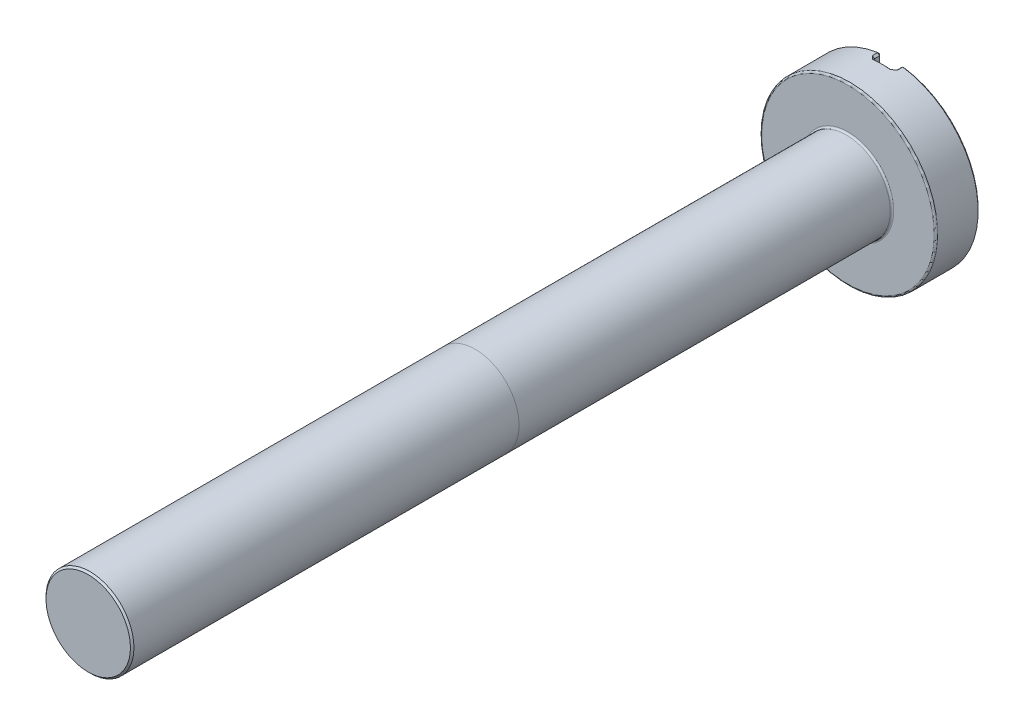
ISO-10303-21;
HEADER;
FILE_DESCRIPTION(('STEP AP214'),'2;1');
FILE_NAME('part.step','',(''),(''),'','','');
FILE_SCHEMA(('AUTOMOTIVE_DESIGN { 1 0 10303 214 1 1 1 1 }'));
ENDSEC;
DATA;
#1=APPLICATION_CONTEXT('core data for automotive mechanical design processes');
#2=APPLICATION_PROTOCOL_DEFINITION('international standard','automotive_design',2000,#1);
#3=PRODUCT_CONTEXT('',#1,'mechanical');
#4=PRODUCT('Part','Part','',(#3));
#5=PRODUCT_RELATED_PRODUCT_CATEGORY('part','',(#4));
#6=PRODUCT_DEFINITION_FORMATION('','',#4);
#7=PRODUCT_DEFINITION_CONTEXT('part definition',#1,'design');
#8=PRODUCT_DEFINITION('design','',#6,#7);
#9=PRODUCT_DEFINITION_SHAPE('','',#8);
#10=(LENGTH_UNIT() NAMED_UNIT(*) SI_UNIT(.MILLI.,.METRE.));
#11=(NAMED_UNIT(*) PLANE_ANGLE_UNIT() SI_UNIT($,.RADIAN.));
#12=(NAMED_UNIT(*) SI_UNIT($,.STERADIAN.) SOLID_ANGLE_UNIT());
#13=UNCERTAINTY_MEASURE_WITH_UNIT(LENGTH_MEASURE(1.E-05),#10,'distance_accuracy_value','');
#14=(GEOMETRIC_REPRESENTATION_CONTEXT(3) GLOBAL_UNCERTAINTY_ASSIGNED_CONTEXT((#13)) GLOBAL_UNIT_ASSIGNED_CONTEXT((#10,
#11,#12)) REPRESENTATION_CONTEXT('',''));
#15=CARTESIAN_POINT('',(0.,0.,0.));
#16=DIRECTION('',(0.,0.,1.));
#17=DIRECTION('',(1.,0.,0.));
#18=AXIS2_PLACEMENT_3D('',#15,#16,#17);
#19=CARTESIAN_POINT('',(0.,0.,216.));
#20=DIRECTION('',(0.,0.,-1.));
#21=DIRECTION('',(-1.,0.,0.));
#22=AXIS2_PLACEMENT_3D('',#19,#20,#21);
#23=CYLINDRICAL_SURFACE('',#22,12.5);
#24=CARTESIAN_POINT('',(0.,0.,215.5));
#25=DIRECTION('',(0.,0.,1.));
#26=DIRECTION('',(1.,0.,0.));
#27=AXIS2_PLACEMENT_3D('',#24,#25,#26);
#28=CIRCLE('',#27,12.5);
#29=CARTESIAN_POINT('',(12.5,0.,215.5));
#30=VERTEX_POINT('',#29);
#31=EDGE_CURVE('E59',#30,#30,#28,.F.);
#32=ORIENTED_EDGE('',*,*,#31,.T.);
#33=EDGE_LOOP('',(#32));
#34=FACE_BOUND('',#33,.T.);
#35=CARTESIAN_POINT('',(0.,0.,106.));
#36=DIRECTION('',(0.,0.,-1.));
#37=DIRECTION('',(-1.,0.,0.));
#38=AXIS2_PLACEMENT_3D('',#35,#36,#37);
#39=CIRCLE('',#38,12.5);
#40=CARTESIAN_POINT('',(-12.5,0.,106.));
#41=VERTEX_POINT('',#40);
#42=EDGE_CURVE('E11',#41,#41,#39,.T.);
#43=ORIENTED_EDGE('',*,*,#42,.F.);
#44=EDGE_LOOP('',(#43));
#45=FACE_BOUND('',#44,.T.);
#46=ADVANCED_FACE('F49',(#34,#45),#23,.T.);
#47=CARTESIAN_POINT('',(0.,0.,-12.5));
#48=DIRECTION('',(0.,0.,1.));
#49=DIRECTION('',(1.,0.,0.));
#50=AXIS2_PLACEMENT_3D('',#47,#48,#49);
#51=CYLINDRICAL_SURFACE('',#50,25.);
#52=CARTESIAN_POINT('',(0.,0.,-0.5));
#53=DIRECTION('',(0.,0.,-1.));
#54=DIRECTION('',(-1.,0.,0.));
#55=AXIS2_PLACEMENT_3D('',#52,#53,#54);
#56=CIRCLE('',#55,25.);
#57=CARTESIAN_POINT('',(-25.,0.,-0.5));
#58=VERTEX_POINT('',#57);
#59=EDGE_CURVE('E215',#58,#58,#56,.T.);
#60=ORIENTED_EDGE('',*,*,#59,.T.);
#61=EDGE_LOOP('',(#60));
#62=FACE_BOUND('',#61,.T.);
#63=CARTESIAN_POINT('',(3.57142857142857,-24.7435829652697,-10.5));
#64=CARTESIAN_POINT('',(3.48283128722029,-24.7563702333068,-10.411341223828));
#65=CARTESIAN_POINT('',(3.39398611806148,-24.7687086598073,-10.3228648452336));
#66=CARTESIAN_POINT('',(3.21576086205343,-24.7924782192305,-10.1463299338049));
#67=CARTESIAN_POINT('',(3.12638077482031,-24.8039093515019,-10.0582714012705));
#68=CARTESIAN_POINT('',(2.87577804068426,-24.8345759248479,-9.81282240398061));
#69=CARTESIAN_POINT('',(2.71391793275932,-24.8527929599123,-9.65595509518249));
#70=CARTESIAN_POINT('',(2.55102040816327,-24.8695053203142,-9.5));
#71=B_SPLINE_CURVE_WITH_KNOTS('',3,(#63,#64,#65,#66,#67,#68,#69,#70),.UNSPECIFIED.,.F.,.F.,(4,2,
2,4),(0.,0.377968117810572,0.75593650689692,1.43431941874157),.UNSPECIFIED.);
#72=CARTESIAN_POINT('',(3.57142857142857,-24.7435829652697,-10.5));
#73=VERTEX_POINT('',#72);
#74=CARTESIAN_POINT('',(2.55102040816327,-24.8695053203142,-9.5));
#75=VERTEX_POINT('',#74);
#76=EDGE_CURVE('E345',#73,#75,#71,.T.);
#77=ORIENTED_EDGE('',*,*,#76,.F.);
#78=DIRECTION('',(0.,0.,1.));
#79=VECTOR('',#78,1.);
#80=CARTESIAN_POINT('',(3.57142857142857,-24.7435829652697,-12.5));
#81=LINE('',#80,#79);
#82=CARTESIAN_POINT('',(3.57142857142857,-24.7435829652697,-12.));
#83=VERTEX_POINT('',#82);
#84=EDGE_CURVE('E355',#73,#83,#81,.F.);
#85=ORIENTED_EDGE('',*,*,#84,.T.);
#86=CARTESIAN_POINT('',(0.,0.,-12.));
#87=DIRECTION('',(0.,0.,-1.));
#88=DIRECTION('',(-1.,0.,0.));
#89=AXIS2_PLACEMENT_3D('',#86,#87,#88);
#90=CIRCLE('',#89,25.);
#91=CARTESIAN_POINT('',(3.57142857142857,24.7435829652697,-12.));
#92=VERTEX_POINT('',#91);
#93=EDGE_CURVE('E991',#83,#92,#90,.F.);
#94=ORIENTED_EDGE('',*,*,#93,.T.);
#95=DIRECTION('',(0.,0.,1.));
#96=VECTOR('',#95,1.);
#97=CARTESIAN_POINT('',(3.57142857142857,24.7435829652697,-12.5));
#98=LINE('',#97,#96);
#99=CARTESIAN_POINT('',(3.57142857142857,24.7435829652697,-10.5));
#100=VERTEX_POINT('',#99);
#101=EDGE_CURVE('E315',#92,#100,#98,.T.);
#102=ORIENTED_EDGE('',*,*,#101,.T.);
#103=CARTESIAN_POINT('',(2.55102040816327,24.8695053203142,-9.5));
#104=CARTESIAN_POINT('',(2.64178191386562,24.8601946587716,-9.58688711502499));
#105=CARTESIAN_POINT('',(2.73221965792439,24.850416341085,-9.67406070203431));
#106=CARTESIAN_POINT('',(2.91248879878854,24.8299345678886,-9.84892451642307));
#107=CARTESIAN_POINT('',(3.00232019629446,24.8192311134479,-9.93661474320537));
#108=CARTESIAN_POINT('',(3.25259245581336,24.7880383809925,-10.1823358745458));
#109=CARTESIAN_POINT('',(3.41240583045985,24.7665328543811,-10.340878285821));
#110=CARTESIAN_POINT('',(3.57142857142857,24.7435829652697,-10.5));
#111=B_SPLINE_CURVE_WITH_KNOTS('',3,(#103,#104,#105,#106,#107,#108,#109,#110),.UNSPECIFIED.,.F.,
.F.,(4,2,2,4),(0.,0.377969208692541,0.755937980612055,1.43432033029294),.UNSPECIFIED.);
#112=CARTESIAN_POINT('',(2.55102040816327,24.8695053203142,-9.5));
#113=VERTEX_POINT('',#112);
#114=EDGE_CURVE('E307',#113,#100,#111,.T.);
#115=ORIENTED_EDGE('',*,*,#114,.F.);
#116=CARTESIAN_POINT('',(0.,0.,-9.5));
#117=DIRECTION('',(0.,0.,1.));
#118=DIRECTION('',(1.,0.,0.));
#119=AXIS2_PLACEMENT_3D('',#116,#117,#118);
#120=CIRCLE('',#119,25.);
#121=CARTESIAN_POINT('',(-2.55102040816327,24.8695053203142,-9.5));
#122=VERTEX_POINT('',#121);
#123=EDGE_CURVE('E292',#113,#122,#120,.T.);
#124=ORIENTED_EDGE('',*,*,#123,.T.);
#125=CARTESIAN_POINT('',(-3.57142857142857,24.7435829652697,-10.5));
#126=CARTESIAN_POINT('',(-3.48283128722029,24.7563702333068,-10.411341223828));
#127=CARTESIAN_POINT('',(-3.39398611806148,24.7687086598073,-10.3228648452336));
#128=CARTESIAN_POINT('',(-3.21576086205343,24.7924782192305,-10.1463299338049));
#129=CARTESIAN_POINT('',(-3.12638077482031,24.8039093515019,-10.0582714012705));
#130=CARTESIAN_POINT('',(-2.87577804068426,24.8345759248479,-9.81282240398061));
#131=CARTESIAN_POINT('',(-2.71391793275932,24.8527929599123,-9.65595509518249));
#132=CARTESIAN_POINT('',(-2.55102040816327,24.8695053203142,-9.5));
#133=B_SPLINE_CURVE_WITH_KNOTS('',3,(#125,#126,#127,#128,#129,#130,#131,#132),.UNSPECIFIED.,.F.,
.F.,(4,2,2,4),(0.,0.377968117810572,0.75593650689692,1.43431941874157),.UNSPECIFIED.);
#134=CARTESIAN_POINT('',(-3.57142857142857,24.7435829652697,-10.5));
#135=VERTEX_POINT('',#134);
#136=EDGE_CURVE('E160',#135,#122,#133,.T.);
#137=ORIENTED_EDGE('',*,*,#136,.F.);
#138=DIRECTION('',(0.,0.,1.));
#139=VECTOR('',#138,1.);
#140=CARTESIAN_POINT('',(-3.57142857142857,24.7435829652697,-12.5));
#141=LINE('',#140,#139);
#142=CARTESIAN_POINT('',(-3.57142857142857,24.7435829652697,-12.));
#143=VERTEX_POINT('',#142);
#144=EDGE_CURVE('E154',#135,#143,#141,.F.);
#145=ORIENTED_EDGE('',*,*,#144,.T.);
#146=CARTESIAN_POINT('',(0.,0.,-12.));
#147=DIRECTION('',(0.,0.,-1.));
#148=DIRECTION('',(-1.,0.,0.));
#149=AXIS2_PLACEMENT_3D('',#146,#147,#148);
#150=CIRCLE('',#149,25.);
#151=CARTESIAN_POINT('',(-3.57142857142857,-24.7435829652697,-12.));
#152=VERTEX_POINT('',#151);
#153=EDGE_CURVE('E157',#143,#152,#150,.F.);
#154=ORIENTED_EDGE('',*,*,#153,.T.);
#155=DIRECTION('',(0.,0.,1.));
#156=VECTOR('',#155,1.);
#157=CARTESIAN_POINT('',(-3.57142857142857,-24.7435829652697,-12.5));
#158=LINE('',#157,#156);
#159=CARTESIAN_POINT('',(-3.57142857142857,-24.7435829652697,-10.5));
#160=VERTEX_POINT('',#159);
#161=EDGE_CURVE('E166',#152,#160,#158,.T.);
#162=ORIENTED_EDGE('',*,*,#161,.T.);
#163=CARTESIAN_POINT('',(-2.55102040816327,-24.8695053203142,-9.5));
#164=CARTESIAN_POINT('',(-2.64178191386562,-24.8601946587716,-9.58688711502499));
#165=CARTESIAN_POINT('',(-2.73221965792439,-24.850416341085,-9.67406070203431));
#166=CARTESIAN_POINT('',(-2.91248879878854,-24.8299345678886,-9.84892451642307));
#167=CARTESIAN_POINT('',(-3.00232019629446,-24.8192311134479,-9.93661474320537));
#168=CARTESIAN_POINT('',(-3.25259245581336,-24.7880383809925,-10.1823358745458));
#169=CARTESIAN_POINT('',(-3.41240583045985,-24.7665328543811,-10.340878285821));
#170=CARTESIAN_POINT('',(-3.57142857142857,-24.7435829652697,-10.5));
#171=B_SPLINE_CURVE_WITH_KNOTS('',3,(#163,#164,#165,#166,#167,#168,#169,#170),.UNSPECIFIED.,.F.,
.F.,(4,2,2,4),(0.,0.377969208692541,0.755937980612055,1.43432033029294),.UNSPECIFIED.);
#172=CARTESIAN_POINT('',(-2.55102040816327,-24.8695053203142,-9.5));
#173=VERTEX_POINT('',#172);
#174=EDGE_CURVE('E301',#173,#160,#171,.T.);
#175=ORIENTED_EDGE('',*,*,#174,.F.);
#176=CARTESIAN_POINT('',(0.,0.,-9.5));
#177=DIRECTION('',(0.,0.,1.));
#178=DIRECTION('',(1.,0.,0.));
#179=AXIS2_PLACEMENT_3D('',#176,#177,#178);
#180=CIRCLE('',#179,25.);
#181=EDGE_CURVE('E544',#173,#75,#180,.T.);
#182=ORIENTED_EDGE('',*,*,#181,.T.);
#183=EDGE_LOOP('',(#77,#85,#94,#102,#115,#124,#137,#145,#154,#162,#175,#182));
#184=FACE_BOUND('',#183,.T.);
#185=ADVANCED_FACE('F156',(#62,#184),#51,.T.);
#186=CARTESIAN_POINT('',(0.,0.,-12.5));
#187=DIRECTION('',(0.,0.,-1.));
#188=DIRECTION('',(-1.,0.,0.));
#189=AXIS2_PLACEMENT_3D('',#186,#187,#188);
#190=PLANE('',#189);
#191=DIRECTION('',(0.,-1.,0.));
#192=VECTOR('',#191,1.);
#193=CARTESIAN_POINT('',(-3.5,-24.8193472919817,-12.5));
#194=LINE('',#193,#192);
#195=CARTESIAN_POINT('',(-3.5,24.2487113059643,-12.5));
#196=VERTEX_POINT('',#195);
#197=CARTESIAN_POINT('',(-3.5,-24.2487113059643,-12.5));
#198=VERTEX_POINT('',#197);
#199=EDGE_CURVE('E65',#196,#198,#194,.T.);
#200=ORIENTED_EDGE('',*,*,#199,.T.);
#201=CARTESIAN_POINT('',(0.,0.,-12.5));
#202=DIRECTION('',(0.,0.,-1.));
#203=DIRECTION('',(-1.,0.,0.));
#204=AXIS2_PLACEMENT_3D('',#201,#202,#203);
#205=CIRCLE('',#204,24.5);
#206=EDGE_CURVE('E220',#198,#196,#205,.T.);
#207=ORIENTED_EDGE('',*,*,#206,.T.);
#208=EDGE_LOOP('',(#200,#207));
#209=FACE_BOUND('',#208,.T.);
#210=ADVANCED_FACE('F258',(#209),#190,.T.);
#211=ORIENTED_EDGE('',*,*,#42,.T.);
#212=EDGE_LOOP('',(#211));
#213=FACE_BOUND('',#212,.T.);
#214=CARTESIAN_POINT('',(0.,0.,0.5));
#215=DIRECTION('',(0.,0.,-1.));
#216=DIRECTION('',(-1.,0.,0.));
#217=AXIS2_PLACEMENT_3D('',#214,#215,#216);
#218=CIRCLE('',#217,12.5);
#219=CARTESIAN_POINT('',(-12.5,0.,0.5));
#220=VERTEX_POINT('',#219);
#221=EDGE_CURVE('E228',#220,#220,#218,.F.);
#222=ORIENTED_EDGE('',*,*,#221,.T.);
#223=EDGE_LOOP('',(#222));
#224=FACE_BOUND('',#223,.T.);
#225=ADVANCED_FACE('F249',(#213,#224),#23,.T.);
#226=CARTESIAN_POINT('',(0.,0.,216.));
#227=DIRECTION('',(0.,0.,1.));
#228=DIRECTION('',(1.,0.,0.));
#229=AXIS2_PLACEMENT_3D('',#226,#227,#228);
#230=PLANE('',#229);
#231=CARTESIAN_POINT('',(0.,0.,216.));
#232=DIRECTION('',(0.,0.,1.));
#233=DIRECTION('',(1.,0.,0.));
#234=AXIS2_PLACEMENT_3D('',#231,#232,#233);
#235=CIRCLE('',#234,12.);
#236=CARTESIAN_POINT('',(12.,0.,216.));
#237=VERTEX_POINT('',#236);
#238=EDGE_CURVE('E232',#237,#237,#235,.T.);
#239=ORIENTED_EDGE('',*,*,#238,.T.);
#240=EDGE_LOOP('',(#239));
#241=FACE_BOUND('',#240,.T.);
#242=ADVANCED_FACE('F246',(#241),#230,.T.);
#243=DIRECTION('',(0.,1.,0.));
#244=VECTOR('',#243,1.);
#245=CARTESIAN_POINT('',(3.5,24.8193472919817,-12.5));
#246=LINE('',#245,#244);
#247=CARTESIAN_POINT('',(3.5,-24.2487113059643,-12.5));
#248=VERTEX_POINT('',#247);
#249=CARTESIAN_POINT('',(3.5,24.2487113059643,-12.5));
#250=VERTEX_POINT('',#249);
#251=EDGE_CURVE('E393',#248,#250,#246,.T.);
#252=ORIENTED_EDGE('',*,*,#251,.T.);
#253=CARTESIAN_POINT('',(0.,0.,-12.5));
#254=DIRECTION('',(0.,0.,-1.));
#255=DIRECTION('',(-1.,0.,0.));
#256=AXIS2_PLACEMENT_3D('',#253,#254,#255);
#257=CIRCLE('',#256,24.5);
#258=EDGE_CURVE('E396',#250,#248,#257,.T.);
#259=ORIENTED_EDGE('',*,*,#258,.T.);
#260=EDGE_LOOP('',(#252,#259));
#261=FACE_BOUND('',#260,.T.);
#262=ADVANCED_FACE('F248',(#261),#190,.T.);
#263=CARTESIAN_POINT('',(0.,0.,0.));
#264=DIRECTION('',(0.,0.,-1.));
#265=DIRECTION('',(-1.,0.,0.));
#266=AXIS2_PLACEMENT_3D('',#263,#264,#265);
#267=PLANE('',#266);
#268=CARTESIAN_POINT('',(0.,0.,0.));
#269=DIRECTION('',(0.,0.,-1.));
#270=DIRECTION('',(-1.,0.,0.));
#271=AXIS2_PLACEMENT_3D('',#268,#269,#270);
#272=CIRCLE('',#271,24.5);
#273=CARTESIAN_POINT('',(-24.5,0.,0.));
#274=VERTEX_POINT('',#273);
#275=EDGE_CURVE('E224',#274,#274,#272,.F.);
#276=ORIENTED_EDGE('',*,*,#275,.T.);
#277=EDGE_LOOP('',(#276));
#278=FACE_BOUND('',#277,.T.);
#279=CARTESIAN_POINT('',(0.,0.,0.));
#280=DIRECTION('',(0.,0.,-1.));
#281=DIRECTION('',(-1.,0.,0.));
#282=AXIS2_PLACEMENT_3D('',#279,#280,#281);
#283=CIRCLE('',#282,13.);
#284=CARTESIAN_POINT('',(-13.,0.,0.));
#285=VERTEX_POINT('',#284);
#286=EDGE_CURVE('E219',#285,#285,#283,.T.);
#287=ORIENTED_EDGE('',*,*,#286,.T.);
#288=EDGE_LOOP('',(#287));
#289=FACE_BOUND('',#288,.T.);
#290=ADVANCED_FACE('F255',(#278,#289),#267,.F.);
#291=CARTESIAN_POINT('',(0.,0.,-10.));
#292=DIRECTION('',(0.,0.,1.));
#293=DIRECTION('',(1.,0.,0.));
#294=AXIS2_PLACEMENT_3D('',#291,#292,#293);
#295=PLANE('',#294);
#296=DIRECTION('',(0.,1.,0.));
#297=VECTOR('',#296,1.);
#298=CARTESIAN_POINT('',(-2.5,24.8193472919817,-10.));
#299=LINE('',#298,#297);
#300=CARTESIAN_POINT('',(-2.5,-24.3721152139079,-10.));
#301=VERTEX_POINT('',#300);
#302=CARTESIAN_POINT('',(-2.5,24.3721152139079,-10.));
#303=VERTEX_POINT('',#302);
#304=EDGE_CURVE('E386',#301,#303,#299,.T.);
#305=ORIENTED_EDGE('',*,*,#304,.T.);
#306=CARTESIAN_POINT('',(0.,0.,-10.));
#307=DIRECTION('',(0.,0.,1.));
#308=DIRECTION('',(1.,0.,0.));
#309=AXIS2_PLACEMENT_3D('',#306,#307,#308);
#310=CIRCLE('',#309,24.5);
#311=CARTESIAN_POINT('',(2.5,24.3721152139079,-10.));
#312=VERTEX_POINT('',#311);
#313=EDGE_CURVE('E389',#303,#312,#310,.F.);
#314=ORIENTED_EDGE('',*,*,#313,.T.);
#315=DIRECTION('',(0.,-1.,0.));
#316=VECTOR('',#315,1.);
#317=CARTESIAN_POINT('',(2.5,-24.8193472919817,-10.));
#318=LINE('',#317,#316);
#319=CARTESIAN_POINT('',(2.5,-24.3721152139079,-10.));
#320=VERTEX_POINT('',#319);
#321=EDGE_CURVE('E380',#312,#320,#318,.T.);
#322=ORIENTED_EDGE('',*,*,#321,.T.);
#323=CARTESIAN_POINT('',(0.,0.,-10.));
#324=DIRECTION('',(0.,0.,1.));
#325=DIRECTION('',(1.,0.,0.));
#326=AXIS2_PLACEMENT_3D('',#323,#324,#325);
#327=CIRCLE('',#326,24.5);
#328=EDGE_CURVE('E383',#320,#301,#327,.F.);
#329=ORIENTED_EDGE('',*,*,#328,.T.);
#330=EDGE_LOOP('',(#305,#314,#322,#329));
#331=FACE_BOUND('',#330,.T.);
#332=ADVANCED_FACE('F555',(#331),#295,.F.);
#333=CARTESIAN_POINT('',(-3.,-35.,-10.));
#334=DIRECTION('',(-1.,0.,0.));
#335=DIRECTION('',(0.,0.,1.));
#336=AXIS2_PLACEMENT_3D('',#333,#334,#335);
#337=PLANE('',#336);
#338=DIRECTION('',(0.,0.,1.));
#339=VECTOR('',#338,1.);
#340=CARTESIAN_POINT('',(-3.,24.2487113059643,-10.));
#341=LINE('',#340,#339);
#342=CARTESIAN_POINT('',(-3.,24.2487113059643,-12.));
#343=VERTEX_POINT('',#342);
#344=CARTESIAN_POINT('',(-3.,24.2487113059643,-10.5));
#345=VERTEX_POINT('',#344);
#346=EDGE_CURVE('E185',#343,#345,#341,.T.);
#347=ORIENTED_EDGE('',*,*,#346,.T.);
#348=DIRECTION('',(0.,-1.,0.));
#349=VECTOR('',#348,1.);
#350=CARTESIAN_POINT('',(-3.,-24.8193472919817,-10.5));
#351=LINE('',#350,#349);
#352=CARTESIAN_POINT('',(-3.,-24.2487113059643,-10.5));
#353=VERTEX_POINT('',#352);
#354=EDGE_CURVE('E377',#345,#353,#351,.T.);
#355=ORIENTED_EDGE('',*,*,#354,.T.);
#356=DIRECTION('',(0.,0.,-1.));
#357=VECTOR('',#356,1.);
#358=CARTESIAN_POINT('',(-3.,-24.2487113059643,-10.));
#359=LINE('',#358,#357);
#360=CARTESIAN_POINT('',(-3.,-24.2487113059643,-12.));
#361=VERTEX_POINT('',#360);
#362=EDGE_CURVE('E372',#353,#361,#359,.T.);
#363=ORIENTED_EDGE('',*,*,#362,.T.);
#364=DIRECTION('',(0.,1.,0.));
#365=VECTOR('',#364,1.);
#366=CARTESIAN_POINT('',(-3.,24.8193472919817,-12.));
#367=LINE('',#366,#365);
#368=EDGE_CURVE('E369',#361,#343,#367,.T.);
#369=ORIENTED_EDGE('',*,*,#368,.T.);
#370=EDGE_LOOP('',(#347,#355,#363,#369));
#371=FACE_BOUND('',#370,.T.);
#372=ADVANCED_FACE('F585',(#371),#337,.F.);
#373=CARTESIAN_POINT('',(3.,-35.,-10.));
#374=DIRECTION('',(1.,0.,0.));
#375=DIRECTION('',(0.,0.,-1.));
#376=AXIS2_PLACEMENT_3D('',#373,#374,#375);
#377=PLANE('',#376);
#378=DIRECTION('',(0.,0.,1.));
#379=VECTOR('',#378,1.);
#380=CARTESIAN_POINT('',(3.,-24.2487113059643,-10.));
#381=LINE('',#380,#379);
#382=CARTESIAN_POINT('',(3.,-24.2487113059643,-12.));
#383=VERTEX_POINT('',#382);
#384=CARTESIAN_POINT('',(3.,-24.2487113059643,-10.5));
#385=VERTEX_POINT('',#384);
#386=EDGE_CURVE('E359',#383,#385,#381,.T.);
#387=ORIENTED_EDGE('',*,*,#386,.T.);
#388=DIRECTION('',(0.,1.,0.));
#389=VECTOR('',#388,1.);
#390=CARTESIAN_POINT('',(3.,24.8193472919817,-10.5));
#391=LINE('',#390,#389);
#392=CARTESIAN_POINT('',(3.,24.2487113059643,-10.5));
#393=VERTEX_POINT('',#392);
#394=EDGE_CURVE('E366',#385,#393,#391,.T.);
#395=ORIENTED_EDGE('',*,*,#394,.T.);
#396=DIRECTION('',(0.,0.,-1.));
#397=VECTOR('',#396,1.);
#398=CARTESIAN_POINT('',(3.,24.2487113059643,-10.));
#399=LINE('',#398,#397);
#400=CARTESIAN_POINT('',(3.,24.2487113059643,-12.));
#401=VERTEX_POINT('',#400);
#402=EDGE_CURVE('E362',#393,#401,#399,.T.);
#403=ORIENTED_EDGE('',*,*,#402,.T.);
#404=DIRECTION('',(0.,-1.,0.));
#405=VECTOR('',#404,1.);
#406=CARTESIAN_POINT('',(3.,-24.8193472919817,-12.));
#407=LINE('',#406,#405);
#408=EDGE_CURVE('E354',#401,#383,#407,.T.);
#409=ORIENTED_EDGE('',*,*,#408,.T.);
#410=EDGE_LOOP('',(#387,#395,#403,#409));
#411=FACE_BOUND('',#410,.T.);
#412=ADVANCED_FACE('F596',(#411),#377,.F.);
#413=CARTESIAN_POINT('',(-3.,-24.2487113059643,-12.));
#414=DIRECTION('',(0.547722557505165,-0.632455532033677,-0.547722557505165));
#415=DIRECTION('',(0.,0.654653670707976,-0.755928946018456));
#416=AXIS2_PLACEMENT_3D('',#413,#414,#415);
#417=PLANE('',#416);
#418=DIRECTION('',(0.755928946018455,0.654653670707976,0.));
#419=VECTOR('',#418,1.);
#420=CARTESIAN_POINT('',(-3.,-24.2487113059643,-12.));
#421=LINE('',#420,#419);
#422=EDGE_CURVE('E181',#152,#361,#421,.T.);
#423=ORIENTED_EDGE('',*,*,#422,.F.);
#424=DIRECTION('',(0.101015254455224,0.699854212223765,-0.707106781186548));
#425=VECTOR('',#424,1.);
#426=CARTESIAN_POINT('',(0.,0.,-37.));
#427=LINE('',#426,#425);
#428=EDGE_CURVE('E173',#198,#152,#427,.F.);
#429=ORIENTED_EDGE('',*,*,#428,.F.);
#430=DIRECTION('',(0.707106781186548,0.,0.707106781186548));
#431=VECTOR('',#430,1.);
#432=CARTESIAN_POINT('',(-3.,-24.2487113059643,-12.));
#433=LINE('',#432,#431);
#434=EDGE_CURVE('E210',#361,#198,#433,.F.);
#435=ORIENTED_EDGE('',*,*,#434,.F.);
#436=EDGE_LOOP('',(#423,#429,#435));
#437=FACE_BOUND('',#436,.T.);
#438=ADVANCED_FACE('F599',(#437),#417,.T.);
#439=CARTESIAN_POINT('',(0.,0.,-12.5));
#440=DIRECTION('',(0.,0.,1.));
#441=DIRECTION('',(1.,0.,0.));
#442=AXIS2_PLACEMENT_3D('',#439,#440,#441);
#443=CONICAL_SURFACE('',#442,24.5,0.785398163397448);
#444=ORIENTED_EDGE('',*,*,#428,.T.);
#445=ORIENTED_EDGE('',*,*,#153,.F.);
#446=DIRECTION('',(-0.101015254455224,0.699854212223765,0.707106781186548));
#447=VECTOR('',#446,1.);
#448=CARTESIAN_POINT('',(0.,0.,-37.));
#449=LINE('',#448,#447);
#450=EDGE_CURVE('E171',#196,#143,#449,.T.);
#451=ORIENTED_EDGE('',*,*,#450,.F.);
#452=ORIENTED_EDGE('',*,*,#206,.F.);
#453=EDGE_LOOP('',(#444,#445,#451,#452));
#454=FACE_BOUND('',#453,.T.);
#455=ADVANCED_FACE('F169',(#454),#443,.T.);
#456=CARTESIAN_POINT('',(-3.,-35.,-12.));
#457=DIRECTION('',(0.707106781186547,0.,-0.707106781186547));
#458=DIRECTION('',(0.,-1.,0.));
#459=AXIS2_PLACEMENT_3D('',#456,#457,#458);
#460=PLANE('',#459);
#461=ORIENTED_EDGE('',*,*,#434,.T.);
#462=ORIENTED_EDGE('',*,*,#199,.F.);
#463=DIRECTION('',(-0.707106781186548,0.,-0.707106781186548));
#464=VECTOR('',#463,1.);
#465=CARTESIAN_POINT('',(-3.28571428571429,24.2487113059643,-12.2857142857143));
#466=LINE('',#465,#464);
#467=EDGE_CURVE('E73',#343,#196,#466,.T.);
#468=ORIENTED_EDGE('',*,*,#467,.F.);
#469=ORIENTED_EDGE('',*,*,#368,.F.);
#470=EDGE_LOOP('',(#461,#462,#468,#469));
#471=FACE_BOUND('',#470,.T.);
#472=ADVANCED_FACE('F588',(#471),#460,.T.);
#473=CARTESIAN_POINT('',(-3.57142857142857,-24.7435829652697,-12.5));
#474=DIRECTION('',(-0.654653670707976,0.755928946018456,0.));
#475=DIRECTION('',(0.,0.,1.));
#476=AXIS2_PLACEMENT_3D('',#473,#474,#475);
#477=PLANE('',#476);
#478=ORIENTED_EDGE('',*,*,#422,.T.);
#479=ORIENTED_EDGE('',*,*,#362,.F.);
#480=DIRECTION('',(0.755928946018456,0.654653670707976,0.));
#481=VECTOR('',#480,1.);
#482=CARTESIAN_POINT('',(-3.57142857142857,-24.7435829652697,-10.5));
#483=LINE('',#482,#481);
#484=EDGE_CURVE('E187',#160,#353,#483,.T.);
#485=ORIENTED_EDGE('',*,*,#484,.F.);
#486=ORIENTED_EDGE('',*,*,#161,.F.);
#487=EDGE_LOOP('',(#478,#479,#485,#486));
#488=FACE_BOUND('',#487,.T.);
#489=ADVANCED_FACE('F639',(#488),#477,.F.);
#490=CARTESIAN_POINT('',(-3.57142857142857,24.7435829652697,-12.));
#491=DIRECTION('',(0.547722557505165,0.632455532033677,-0.547722557505165));
#492=DIRECTION('',(0.,0.654653670707976,0.755928946018456));
#493=AXIS2_PLACEMENT_3D('',#490,#491,#492);
#494=PLANE('',#493);
#495=ORIENTED_EDGE('',*,*,#467,.T.);
#496=ORIENTED_EDGE('',*,*,#450,.T.);
#497=DIRECTION('',(0.755928946018455,-0.654653670707976,0.));
#498=VECTOR('',#497,1.);
#499=CARTESIAN_POINT('',(-3.57142857142857,24.7435829652697,-12.));
#500=LINE('',#499,#498);
#501=EDGE_CURVE('E178',#343,#143,#500,.F.);
#502=ORIENTED_EDGE('',*,*,#501,.F.);
#503=EDGE_LOOP('',(#495,#496,#502));
#504=FACE_BOUND('',#503,.T.);
#505=ADVANCED_FACE('F177',(#504),#494,.T.);
#506=CARTESIAN_POINT('',(-2.5,-24.3721152139079,-10.));
#507=CARTESIAN_POINT('',(-3.,-24.2487113059643,-10.5));
#508=CARTESIAN_POINT('',(-2.55102040816327,-24.8695053203142,-9.5));
#509=CARTESIAN_POINT('',(-3.57142857142857,-24.7435829652697,-10.5));
#510=CARTESIAN_POINT('',(-2.55185023576887,-24.8775951819187,-9.49186768946509));
#511=CARTESIAN_POINT('',(-3.58072264061133,-24.7516318652865,-10.5));
#512=B_SPLINE_SURFACE_WITH_KNOTS('',1,1,((#506,#507),(#508,#509),(#510,#511)),.UNSPECIFIED.,.F.,
.F.,.F.,(2,1,2),(2,2),(0.,1.,1.01626462106982),(0.,1.),.UNSPECIFIED.);
#513=CARTESIAN_POINT('',(-3.,-24.2487113059643,-10.5));
#514=CARTESIAN_POINT('',(-2.9561196801493,-24.2595413118671,-10.4561196801493));
#515=CARTESIAN_POINT('',(-2.9122393602986,-24.2703713177699,-10.4122393602986));
#516=CARTESIAN_POINT('',(-2.84641888052255,-24.286616326624,-10.3464188805225));
#517=CARTESIAN_POINT('',(-2.8244787205972,-24.2920313295754,-10.3244787205972));
#518=CARTESIAN_POINT('',(-2.78059840074649,-24.3028613354782,-10.2805984007465));
#519=CARTESIAN_POINT('',(-2.75865824082114,-24.3082763384296,-10.2586582408211));
#520=CARTESIAN_POINT('',(-2.71477792097044,-24.3191063443324,-10.2147779209704));
#521=CARTESIAN_POINT('',(-2.69283776104509,-24.3245213472838,-10.1928377610451));
#522=CARTESIAN_POINT('',(-2.64895744119439,-24.3353513531865,-10.1489574411944));
#523=CARTESIAN_POINT('',(-2.62701728126904,-24.3407663561379,-10.127017281269));
#524=CARTESIAN_POINT('',(-2.57005141422913,-24.3548259773622,-10.0700514142291));
#525=CARTESIAN_POINT('',(-2.53502570711456,-24.363470595635,-10.0350257071146));
#526=CARTESIAN_POINT('',(-2.5,-24.3721152139079,-10.));
#527=B_SPLINE_CURVE_WITH_KNOTS('',3,(#513,#514,#515,#516,#517,#518,#519,#520,#521,#522,#523,
#524,#525,#526),.UNSPECIFIED.,.F.,.F.,(4,2,2,2,2,2,4),(0.,0.188982236504614,0.283473354756921,
0.377964473009228,0.472455591261535,0.566946709513842,0.717794207622041),.UNSPECIFIED.);
#528=EDGE_CURVE('E188',#301,#353,#527,.F.);
#529=DIRECTION('',(-0.072153753182301,-0.703415834269962,0.707106781186548));
#530=VECTOR('',#529,1.);
#531=CARTESIAN_POINT('',(-2.5,-24.3721152139079,-10.));
#532=LINE('',#531,#530);
#533=EDGE_CURVE('E195',#173,#301,#532,.F.);
#534=ORIENTED_EDGE('',*,*,#174,.T.);
#535=ORIENTED_EDGE('',*,*,#484,.T.);
#536=ORIENTED_EDGE('',*,*,#528,.F.);
#537=ORIENTED_EDGE('',*,*,#533,.F.);
#538=EDGE_LOOP('',(#534,#535,#536,#537));
#539=FACE_BOUND('',#538,.T.);
#540=ADVANCED_FACE('F548',(#539),#512,.T.);
#541=CARTESIAN_POINT('',(-3.57142857142857,24.7435829652697,-12.5));
#542=DIRECTION('',(0.654653670707976,0.755928946018456,0.));
#543=DIRECTION('',(0.,0.,1.));
#544=AXIS2_PLACEMENT_3D('',#541,#542,#543);
#545=PLANE('',#544);
#546=ORIENTED_EDGE('',*,*,#501,.T.);
#547=ORIENTED_EDGE('',*,*,#144,.F.);
#548=DIRECTION('',(-0.755928946018456,0.654653670707976,0.));
#549=VECTOR('',#548,1.);
#550=CARTESIAN_POINT('',(-3.,24.2487113059643,-10.5));
#551=LINE('',#550,#549);
#552=EDGE_CURVE('E526',#345,#135,#551,.T.);
#553=ORIENTED_EDGE('',*,*,#552,.F.);
#554=ORIENTED_EDGE('',*,*,#346,.F.);
#555=EDGE_LOOP('',(#546,#547,#553,#554));
#556=FACE_BOUND('',#555,.T.);
#557=ADVANCED_FACE('F183',(#556),#545,.T.);
#558=CARTESIAN_POINT('',(-2.5,0.,-10.));
#559=DIRECTION('',(0.707106781186547,0.,-0.707106781186547));
#560=DIRECTION('',(0.,-1.,0.));
#561=AXIS2_PLACEMENT_3D('',#558,#559,#560);
#562=PLANE('',#561);
#563=ORIENTED_EDGE('',*,*,#528,.T.);
#564=ORIENTED_EDGE('',*,*,#354,.F.);
#565=CARTESIAN_POINT('',(-2.5,24.3721152139079,-10.));
#566=CARTESIAN_POINT('',(-2.52194015992535,24.3667002109565,-10.0219401599254));
#567=CARTESIAN_POINT('',(-2.5438803198507,24.3612852080051,-10.0438803198507));
#568=CARTESIAN_POINT('',(-2.5877606397014,24.3504552021023,-10.0877606397014));
#569=CARTESIAN_POINT('',(-2.60970079962675,24.3450401991509,-10.1097007996268));
#570=CARTESIAN_POINT('',(-2.65358111947745,24.3342101932481,-10.1535811194775));
#571=CARTESIAN_POINT('',(-2.6755212794028,24.3287951902968,-10.1755212794028));
#572=CARTESIAN_POINT('',(-2.7194015992535,24.317965184394,-10.2194015992535));
#573=CARTESIAN_POINT('',(-2.74134175917886,24.3125501814426,-10.2413417591789));
#574=CARTESIAN_POINT('',(-2.78522207902956,24.3017201755398,-10.2852220790296));
#575=CARTESIAN_POINT('',(-2.80716223895491,24.2963051725884,-10.3071622389549));
#576=CARTESIAN_POINT('',(-2.88606826592017,24.2768305484128,-10.3860682659202));
#577=CARTESIAN_POINT('',(-2.94303413296009,24.2627709271885,-10.4430341329601));
#578=CARTESIAN_POINT('',(-3.,24.2487113059643,-10.5));
#579=B_SPLINE_CURVE_WITH_KNOTS('',3,(#565,#566,#567,#568,#569,#570,#571,#572,#573,#574,#575,
#576,#577,#578),.UNSPECIFIED.,.F.,.F.,(4,2,2,2,2,2,4),(0.,0.0944911182523072,0.188982236504614,
0.283473354756921,0.377964473009228,0.472455591261535,0.717794207622041),.UNSPECIFIED.);
#580=EDGE_CURVE('E518',#303,#345,#579,.T.);
#581=ORIENTED_EDGE('',*,*,#580,.F.);
#582=ORIENTED_EDGE('',*,*,#304,.F.);
#583=EDGE_LOOP('',(#563,#564,#581,#582));
#584=FACE_BOUND('',#583,.T.);
#585=ADVANCED_FACE('F509',(#584),#562,.T.);
#586=CARTESIAN_POINT('',(0.,0.,-9.5));
#587=DIRECTION('',(0.,0.,1.));
#588=DIRECTION('',(1.,0.,0.));
#589=AXIS2_PLACEMENT_3D('',#586,#587,#588);
#590=CONICAL_SURFACE('',#589,25.,0.785398163397448);
#591=ORIENTED_EDGE('',*,*,#533,.T.);
#592=ORIENTED_EDGE('',*,*,#328,.F.);
#593=DIRECTION('',(-0.072153753182301,0.703415834269962,-0.707106781186548));
#594=VECTOR('',#593,1.);
#595=CARTESIAN_POINT('',(2.55102040816327,-24.8695053203142,-9.5));
#596=LINE('',#595,#594);
#597=EDGE_CURVE('E527',#75,#320,#596,.T.);
#598=ORIENTED_EDGE('',*,*,#597,.F.);
#599=ORIENTED_EDGE('',*,*,#181,.F.);
#600=EDGE_LOOP('',(#591,#592,#598,#599));
#601=FACE_BOUND('',#600,.T.);
#602=ADVANCED_FACE('F541',(#601),#590,.T.);
#603=CARTESIAN_POINT('',(3.57142857142857,-24.7435829652697,-12.5));
#604=DIRECTION('',(-0.654653670707976,-0.755928946018456,0.));
#605=DIRECTION('',(0.,0.,1.));
#606=AXIS2_PLACEMENT_3D('',#603,#604,#605);
#607=PLANE('',#606);
#608=DIRECTION('',(-0.755928946018455,0.654653670707976,0.));
#609=VECTOR('',#608,1.);
#610=CARTESIAN_POINT('',(3.57142857142857,-24.7435829652697,-12.));
#611=LINE('',#610,#609);
#612=EDGE_CURVE('E531',#83,#383,#611,.T.);
#613=ORIENTED_EDGE('',*,*,#612,.F.);
#614=ORIENTED_EDGE('',*,*,#84,.F.);
#615=DIRECTION('',(0.755928946018456,-0.654653670707976,0.));
#616=VECTOR('',#615,1.);
#617=CARTESIAN_POINT('',(3.,-24.2487113059643,-10.5));
#618=LINE('',#617,#616);
#619=EDGE_CURVE('E564',#385,#73,#618,.T.);
#620=ORIENTED_EDGE('',*,*,#619,.F.);
#621=ORIENTED_EDGE('',*,*,#386,.F.);
#622=EDGE_LOOP('',(#613,#614,#620,#621));
#623=FACE_BOUND('',#622,.T.);
#624=ADVANCED_FACE('F684',(#623),#607,.T.);
#625=CARTESIAN_POINT('',(3.57142857142857,-24.7435829652697,-12.));
#626=DIRECTION('',(-0.547722557505165,-0.632455532033677,-0.547722557505165));
#627=DIRECTION('',(0.,0.654653670707976,-0.755928946018456));
#628=AXIS2_PLACEMENT_3D('',#625,#626,#627);
#629=PLANE('',#628);
#630=DIRECTION('',(0.101015254455224,-0.699854212223765,0.707106781186548));
#631=VECTOR('',#630,1.);
#632=CARTESIAN_POINT('',(0.,0.,-37.));
#633=LINE('',#632,#631);
#634=EDGE_CURVE('E570',#83,#248,#633,.F.);
#635=ORIENTED_EDGE('',*,*,#634,.F.);
#636=ORIENTED_EDGE('',*,*,#612,.T.);
#637=DIRECTION('',(0.707106781186548,0.,-0.707106781186548));
#638=VECTOR('',#637,1.);
#639=CARTESIAN_POINT('',(3.28571428571429,-24.2487113059643,-12.2857142857143));
#640=LINE('',#639,#638);
#641=EDGE_CURVE('E567',#248,#383,#640,.F.);
#642=ORIENTED_EDGE('',*,*,#641,.F.);
#643=EDGE_LOOP('',(#635,#636,#642));
#644=FACE_BOUND('',#643,.T.);
#645=ADVANCED_FACE('F690',(#644),#629,.T.);
#646=CARTESIAN_POINT('',(-3.,24.2487113059643,-10.5));
#647=CARTESIAN_POINT('',(-2.5,24.3721152139079,-10.));
#648=CARTESIAN_POINT('',(-3.57142857142857,24.7435829652697,-10.5));
#649=CARTESIAN_POINT('',(-2.55102040816327,24.8695053203142,-9.5));
#650=CARTESIAN_POINT('',(-3.58063042571899,24.7515520048471,-10.5));
#651=CARTESIAN_POINT('',(-2.55184200229634,24.8775149150623,-9.49194837749588));
#652=B_SPLINE_SURFACE_WITH_KNOTS('',1,1,((#646,#647),(#648,#649),(#650,#651)),.UNSPECIFIED.,.F.,
.F.,.F.,(2,1,2),(2,2),(0.,1.,1.01610324500823),(0.,1.),.UNSPECIFIED.);
#653=DIRECTION('',(0.072153753182301,-0.703415834269962,-0.707106781186548));
#654=VECTOR('',#653,1.);
#655=CARTESIAN_POINT('',(-2.55102040816327,24.8695053203142,-9.5));
#656=LINE('',#655,#654);
#657=EDGE_CURVE('E451',#303,#122,#656,.F.);
#658=ORIENTED_EDGE('',*,*,#552,.T.);
#659=ORIENTED_EDGE('',*,*,#136,.T.);
#660=ORIENTED_EDGE('',*,*,#657,.F.);
#661=ORIENTED_EDGE('',*,*,#580,.T.);
#662=EDGE_LOOP('',(#658,#659,#660,#661));
#663=FACE_BOUND('',#662,.T.);
#664=ADVANCED_FACE('F496',(#663),#652,.T.);
#665=CARTESIAN_POINT('',(3.,-24.2487113059643,-10.5));
#666=CARTESIAN_POINT('',(2.5,-24.3721152139079,-10.));
#667=CARTESIAN_POINT('',(3.57142857142857,-24.7435829652697,-10.5));
#668=CARTESIAN_POINT('',(2.55102040816327,-24.8695053203142,-9.5));
#669=CARTESIAN_POINT('',(3.58063042571899,-24.7515520048471,-10.5));
#670=CARTESIAN_POINT('',(2.55184200229634,-24.8775149150623,-9.49194837749588));
#671=B_SPLINE_SURFACE_WITH_KNOTS('',1,1,((#665,#666),(#667,#668),(#669,#670)),.UNSPECIFIED.,.F.,
.F.,.F.,(2,1,2),(2,2),(0.,1.,1.01610324500823),(0.,1.),.UNSPECIFIED.);
#672=CARTESIAN_POINT('',(2.5,-24.3721152139079,-10.));
#673=CARTESIAN_POINT('',(2.52194015992535,-24.3667002109565,-10.0219401599254));
#674=CARTESIAN_POINT('',(2.5438803198507,-24.3612852080051,-10.0438803198507));
#675=CARTESIAN_POINT('',(2.5877606397014,-24.3504552021023,-10.0877606397014));
#676=CARTESIAN_POINT('',(2.60970079962675,-24.3450401991509,-10.1097007996268));
#677=CARTESIAN_POINT('',(2.65358111947745,-24.3342101932481,-10.1535811194775));
#678=CARTESIAN_POINT('',(2.6755212794028,-24.3287951902968,-10.1755212794028));
#679=CARTESIAN_POINT('',(2.7194015992535,-24.317965184394,-10.2194015992535));
#680=CARTESIAN_POINT('',(2.74134175917886,-24.3125501814426,-10.2413417591789));
#681=CARTESIAN_POINT('',(2.78522207902956,-24.3017201755398,-10.2852220790296));
#682=CARTESIAN_POINT('',(2.80716223895491,-24.2963051725884,-10.3071622389549));
#683=CARTESIAN_POINT('',(2.88606826592017,-24.2768305484128,-10.3860682659202));
#684=CARTESIAN_POINT('',(2.94303413296009,-24.2627709271885,-10.4430341329601));
#685=CARTESIAN_POINT('',(3.,-24.2487113059643,-10.5));
#686=B_SPLINE_CURVE_WITH_KNOTS('',3,(#672,#673,#674,#675,#676,#677,#678,#679,#680,#681,#682,
#683,#684,#685),.UNSPECIFIED.,.F.,.F.,(4,2,2,2,2,2,4),(0.,0.0944911182523072,0.188982236504614,
0.283473354756921,0.377964473009228,0.472455591261535,0.717794207622041),.UNSPECIFIED.);
#687=EDGE_CURVE('E441',#385,#320,#686,.F.);
#688=ORIENTED_EDGE('',*,*,#76,.T.);
#689=ORIENTED_EDGE('',*,*,#597,.T.);
#690=ORIENTED_EDGE('',*,*,#687,.F.);
#691=ORIENTED_EDGE('',*,*,#619,.T.);
#692=EDGE_LOOP('',(#688,#689,#690,#691));
#693=FACE_BOUND('',#692,.T.);
#694=ADVANCED_FACE('F487',(#693),#671,.T.);
#695=CARTESIAN_POINT('',(3.,-35.,-12.));
#696=DIRECTION('',(-0.707106781186547,0.,-0.707106781186547));
#697=DIRECTION('',(0.,1.,0.));
#698=AXIS2_PLACEMENT_3D('',#695,#696,#697);
#699=PLANE('',#698);
#700=ORIENTED_EDGE('',*,*,#641,.T.);
#701=ORIENTED_EDGE('',*,*,#408,.F.);
#702=DIRECTION('',(-0.707106781186548,0.,0.707106781186548));
#703=VECTOR('',#702,1.);
#704=CARTESIAN_POINT('',(3.,24.2487113059643,-12.));
#705=LINE('',#704,#703);
#706=EDGE_CURVE('E452',#250,#401,#705,.T.);
#707=ORIENTED_EDGE('',*,*,#706,.F.);
#708=ORIENTED_EDGE('',*,*,#251,.F.);
#709=EDGE_LOOP('',(#700,#701,#707,#708));
#710=FACE_BOUND('',#709,.T.);
#711=ADVANCED_FACE('F480',(#710),#699,.T.);
#712=CARTESIAN_POINT('',(0.,0.,-12.5));
#713=DIRECTION('',(0.,0.,1.));
#714=DIRECTION('',(1.,0.,0.));
#715=AXIS2_PLACEMENT_3D('',#712,#713,#714);
#716=CONICAL_SURFACE('',#715,24.5,0.785398163397448);
#717=ORIENTED_EDGE('',*,*,#634,.T.);
#718=ORIENTED_EDGE('',*,*,#258,.F.);
#719=DIRECTION('',(-0.101015254455224,-0.699854212223765,-0.707106781186548));
#720=VECTOR('',#719,1.);
#721=CARTESIAN_POINT('',(0.,0.,-37.));
#722=LINE('',#721,#720);
#723=EDGE_CURVE('E983',#92,#250,#722,.T.);
#724=ORIENTED_EDGE('',*,*,#723,.F.);
#725=ORIENTED_EDGE('',*,*,#93,.F.);
#726=EDGE_LOOP('',(#717,#718,#724,#725));
#727=FACE_BOUND('',#726,.T.);
#728=ADVANCED_FACE('F473',(#727),#716,.T.);
#729=CARTESIAN_POINT('',(0.,0.,-9.5));
#730=DIRECTION('',(0.,0.,1.));
#731=DIRECTION('',(1.,0.,0.));
#732=AXIS2_PLACEMENT_3D('',#729,#730,#731);
#733=CONICAL_SURFACE('',#732,25.,0.785398163397448);
#734=ORIENTED_EDGE('',*,*,#657,.T.);
#735=ORIENTED_EDGE('',*,*,#123,.F.);
#736=DIRECTION('',(0.072153753182301,0.703415834269962,0.707106781186548));
#737=VECTOR('',#736,1.);
#738=CARTESIAN_POINT('',(2.5,24.3721152139079,-10.));
#739=LINE('',#738,#737);
#740=EDGE_CURVE('E418',#312,#113,#739,.T.);
#741=ORIENTED_EDGE('',*,*,#740,.F.);
#742=ORIENTED_EDGE('',*,*,#313,.F.);
#743=EDGE_LOOP('',(#734,#735,#741,#742));
#744=FACE_BOUND('',#743,.T.);
#745=ADVANCED_FACE('F433',(#744),#733,.T.);
#746=CARTESIAN_POINT('',(2.5,0.,-10.));
#747=DIRECTION('',(-0.707106781186547,0.,-0.707106781186547));
#748=DIRECTION('',(0.,1.,0.));
#749=AXIS2_PLACEMENT_3D('',#746,#747,#748);
#750=PLANE('',#749);
#751=ORIENTED_EDGE('',*,*,#687,.T.);
#752=ORIENTED_EDGE('',*,*,#321,.F.);
#753=CARTESIAN_POINT('',(3.,24.2487113059643,-10.5));
#754=CARTESIAN_POINT('',(2.9561196801493,24.2595413118671,-10.4561196801493));
#755=CARTESIAN_POINT('',(2.9122393602986,24.2703713177699,-10.4122393602986));
#756=CARTESIAN_POINT('',(2.84641888052255,24.286616326624,-10.3464188805225));
#757=CARTESIAN_POINT('',(2.8244787205972,24.2920313295754,-10.3244787205972));
#758=CARTESIAN_POINT('',(2.78059840074649,24.3028613354782,-10.2805984007465));
#759=CARTESIAN_POINT('',(2.75865824082114,24.3082763384296,-10.2586582408211));
#760=CARTESIAN_POINT('',(2.71477792097044,24.3191063443324,-10.2147779209704));
#761=CARTESIAN_POINT('',(2.69283776104509,24.3245213472838,-10.1928377610451));
#762=CARTESIAN_POINT('',(2.64895744119439,24.3353513531865,-10.1489574411944));
#763=CARTESIAN_POINT('',(2.62701728126904,24.3407663561379,-10.127017281269));
#764=CARTESIAN_POINT('',(2.57005141422913,24.3548259773622,-10.0700514142291));
#765=CARTESIAN_POINT('',(2.53502570711456,24.363470595635,-10.0350257071146));
#766=CARTESIAN_POINT('',(2.5,24.3721152139079,-10.));
#767=B_SPLINE_CURVE_WITH_KNOTS('',3,(#753,#754,#755,#756,#757,#758,#759,#760,#761,#762,#763,
#764,#765,#766),.UNSPECIFIED.,.F.,.F.,(4,2,2,2,2,2,4),(0.,0.188982236504614,0.283473354756921,
0.377964473009228,0.472455591261535,0.566946709513842,0.717794207622041),.UNSPECIFIED.);
#768=EDGE_CURVE('E410',#393,#312,#767,.T.);
#769=ORIENTED_EDGE('',*,*,#768,.F.);
#770=ORIENTED_EDGE('',*,*,#394,.F.);
#771=EDGE_LOOP('',(#751,#752,#769,#770));
#772=FACE_BOUND('',#771,.T.);
#773=ADVANCED_FACE('F425',(#772),#750,.T.);
#774=CARTESIAN_POINT('',(3.,24.2487113059643,-12.));
#775=DIRECTION('',(-0.547722557505165,0.632455532033677,-0.547722557505165));
#776=DIRECTION('',(0.,0.654653670707976,0.755928946018456));
#777=AXIS2_PLACEMENT_3D('',#774,#775,#776);
#778=PLANE('',#777);
#779=ORIENTED_EDGE('',*,*,#723,.T.);
#780=ORIENTED_EDGE('',*,*,#706,.T.);
#781=DIRECTION('',(-0.755928946018455,-0.654653670707976,0.));
#782=VECTOR('',#781,1.);
#783=CARTESIAN_POINT('',(3.,24.2487113059643,-12.));
#784=LINE('',#783,#782);
#785=EDGE_CURVE('E407',#92,#401,#784,.T.);
#786=ORIENTED_EDGE('',*,*,#785,.F.);
#787=EDGE_LOOP('',(#779,#780,#786));
#788=FACE_BOUND('',#787,.T.);
#789=ADVANCED_FACE('F432',(#788),#778,.T.);
#790=CARTESIAN_POINT('',(2.5,24.3721152139079,-10.));
#791=CARTESIAN_POINT('',(3.,24.2487113059643,-10.5));
#792=CARTESIAN_POINT('',(2.55102040816327,24.8695053203142,-9.5));
#793=CARTESIAN_POINT('',(3.57142857142857,24.7435829652697,-10.5));
#794=CARTESIAN_POINT('',(2.55185023576887,24.8775951819187,-9.49186768946509));
#795=CARTESIAN_POINT('',(3.58072264061133,24.7516318652865,-10.5));
#796=B_SPLINE_SURFACE_WITH_KNOTS('',1,1,((#790,#791),(#792,#793),(#794,#795)),.UNSPECIFIED.,.F.,
.F.,.F.,(2,1,2),(2,2),(0.,1.,1.01626462106982),(0.,1.),.UNSPECIFIED.);
#797=DIRECTION('',(-0.755928946018456,-0.654653670707976,0.));
#798=VECTOR('',#797,1.);
#799=CARTESIAN_POINT('',(3.57142857142857,24.7435829652697,-10.5));
#800=LINE('',#799,#798);
#801=EDGE_CURVE('E404',#393,#100,#800,.F.);
#802=ORIENTED_EDGE('',*,*,#740,.T.);
#803=ORIENTED_EDGE('',*,*,#114,.T.);
#804=ORIENTED_EDGE('',*,*,#801,.F.);
#805=ORIENTED_EDGE('',*,*,#768,.T.);
#806=EDGE_LOOP('',(#802,#803,#804,#805));
#807=FACE_BOUND('',#806,.T.);
#808=ADVANCED_FACE('F435',(#807),#796,.T.);
#809=CARTESIAN_POINT('',(3.57142857142857,24.7435829652697,-12.5));
#810=DIRECTION('',(0.654653670707976,-0.755928946018456,0.));
#811=DIRECTION('',(0.,0.,1.));
#812=AXIS2_PLACEMENT_3D('',#809,#810,#811);
#813=PLANE('',#812);
#814=ORIENTED_EDGE('',*,*,#785,.T.);
#815=ORIENTED_EDGE('',*,*,#402,.F.);
#816=ORIENTED_EDGE('',*,*,#801,.T.);
#817=ORIENTED_EDGE('',*,*,#101,.F.);
#818=EDGE_LOOP('',(#814,#815,#816,#817));
#819=FACE_BOUND('',#818,.T.);
#820=ADVANCED_FACE('F338',(#819),#813,.F.);
#821=CARTESIAN_POINT('',(0.,0.,-0.5));
#822=DIRECTION('',(0.,0.,-1.));
#823=DIRECTION('',(-1.,0.,0.));
#824=AXIS2_PLACEMENT_3D('',#821,#822,#823);
#825=TOROIDAL_SURFACE('',#824,24.5,0.5);
#826=ORIENTED_EDGE('',*,*,#275,.F.);
#827=EDGE_LOOP('',(#826));
#828=FACE_BOUND('',#827,.T.);
#829=ORIENTED_EDGE('',*,*,#59,.F.);
#830=EDGE_LOOP('',(#829));
#831=FACE_BOUND('',#830,.T.);
#832=ADVANCED_FACE('F614',(#828,#831),#825,.T.);
#833=CARTESIAN_POINT('',(0.,0.,0.5));
#834=DIRECTION('',(0.,0.,-1.));
#835=DIRECTION('',(-1.,0.,0.));
#836=AXIS2_PLACEMENT_3D('',#833,#834,#835);
#837=TOROIDAL_SURFACE('',#836,13.,0.5);
#838=ORIENTED_EDGE('',*,*,#286,.F.);
#839=EDGE_LOOP('',(#838));
#840=FACE_BOUND('',#839,.T.);
#841=ORIENTED_EDGE('',*,*,#221,.F.);
#842=EDGE_LOOP('',(#841));
#843=FACE_BOUND('',#842,.T.);
#844=ADVANCED_FACE('F243',(#840,#843),#837,.F.);
#845=CARTESIAN_POINT('',(0.,0.,216.));
#846=DIRECTION('',(0.,0.,-1.));
#847=DIRECTION('',(-1.,0.,0.));
#848=AXIS2_PLACEMENT_3D('',#845,#846,#847);
#849=CONICAL_SURFACE('',#848,12.,0.785398163397466);
#850=ORIENTED_EDGE('',*,*,#31,.F.);
#851=EDGE_LOOP('',(#850));
#852=FACE_BOUND('',#851,.T.);
#853=ORIENTED_EDGE('',*,*,#238,.F.);
#854=EDGE_LOOP('',(#853));
#855=FACE_BOUND('',#854,.T.);
#856=ADVANCED_FACE('F52',(#852,#855),#849,.T.);
#857=CLOSED_SHELL('',(#46,#185,#210,#225,#242,#262,#290,#332,#372,#412,#438,#455,#472,#489,#505,
#540,#557,#585,#602,#624,#645,#664,#694,#711,#728,#745,#773,#789,#808,#820,#832,#844,#856));
#858=MANIFOLD_SOLID_BREP('B2',#857);
#859=ADVANCED_BREP_SHAPE_REPRESENTATION('',(#18,#858),#14);
#860=SHAPE_DEFINITION_REPRESENTATION(#9,#859);
ENDSEC;
END-ISO-10303-21;
